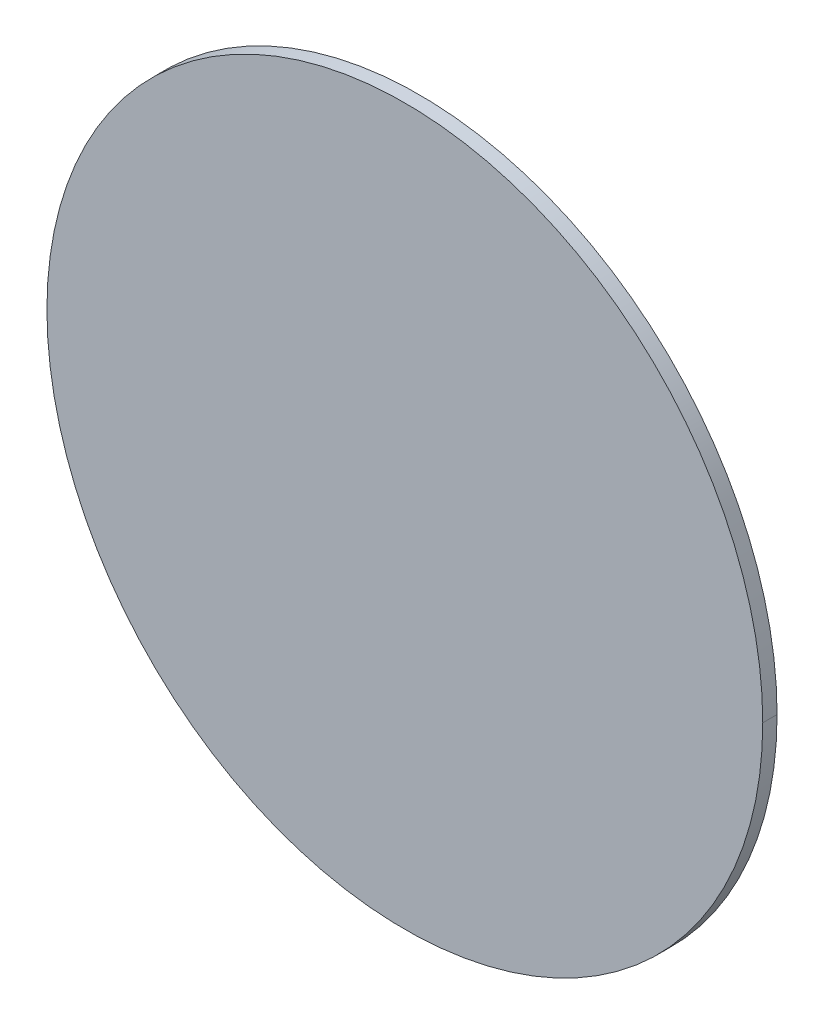
ISO-10303-21;
HEADER;
FILE_DESCRIPTION(('STEP AP214'),'2;1');
FILE_NAME('part.step','',(''),(''),'','','');
FILE_SCHEMA(('AUTOMOTIVE_DESIGN { 1 0 10303 214 1 1 1 1 }'));
ENDSEC;
DATA;
#1=APPLICATION_CONTEXT('core data for automotive mechanical design processes');
#2=APPLICATION_PROTOCOL_DEFINITION('international standard','automotive_design',2000,#1);
#3=PRODUCT_CONTEXT('',#1,'mechanical');
#4=PRODUCT('Part','Part','',(#3));
#5=PRODUCT_RELATED_PRODUCT_CATEGORY('part','',(#4));
#6=PRODUCT_DEFINITION_FORMATION('','',#4);
#7=PRODUCT_DEFINITION_CONTEXT('part definition',#1,'design');
#8=PRODUCT_DEFINITION('design','',#6,#7);
#9=PRODUCT_DEFINITION_SHAPE('','',#8);
#10=(LENGTH_UNIT() NAMED_UNIT(*) SI_UNIT(.MILLI.,.METRE.));
#11=(NAMED_UNIT(*) PLANE_ANGLE_UNIT() SI_UNIT($,.RADIAN.));
#12=(NAMED_UNIT(*) SI_UNIT($,.STERADIAN.) SOLID_ANGLE_UNIT());
#13=UNCERTAINTY_MEASURE_WITH_UNIT(LENGTH_MEASURE(1.E-05),#10,'distance_accuracy_value','');
#14=(GEOMETRIC_REPRESENTATION_CONTEXT(3) GLOBAL_UNCERTAINTY_ASSIGNED_CONTEXT((#13)) GLOBAL_UNIT_ASSIGNED_CONTEXT((#10,
#11,#12)) REPRESENTATION_CONTEXT('',''));
#15=CARTESIAN_POINT('',(0.,0.,0.));
#16=DIRECTION('',(0.,0.,1.));
#17=DIRECTION('',(1.,0.,0.));
#18=AXIS2_PLACEMENT_3D('',#15,#16,#17);
#19=CARTESIAN_POINT('',(0.,0.,4.));
#20=DIRECTION('',(0.,0.,1.));
#21=DIRECTION('',(1.,0.,0.));
#22=AXIS2_PLACEMENT_3D('',#19,#20,#21);
#23=PLANE('',#22);
#24=CARTESIAN_POINT('',(0.,0.,4.));
#25=DIRECTION('',(0.,0.,1.));
#26=DIRECTION('',(1.,0.,0.));
#27=AXIS2_PLACEMENT_3D('',#24,#25,#26);
#28=CIRCLE('',#27,100.);
#29=CARTESIAN_POINT('',(-100.,0.,4.));
#30=VERTEX_POINT('',#29);
#31=CARTESIAN_POINT('',(100.,0.,4.));
#32=VERTEX_POINT('',#31);
#33=EDGE_CURVE('E20',#30,#32,#28,.F.);
#34=ORIENTED_EDGE('',*,*,#33,.F.);
#35=CARTESIAN_POINT('',(0.,0.,4.));
#36=DIRECTION('',(0.,0.,1.));
#37=DIRECTION('',(1.,0.,0.));
#38=AXIS2_PLACEMENT_3D('',#35,#36,#37);
#39=CIRCLE('',#38,100.);
#40=EDGE_CURVE('E50',#32,#30,#39,.F.);
#41=ORIENTED_EDGE('',*,*,#40,.F.);
#42=EDGE_LOOP('',(#34,#41));
#43=FACE_BOUND('',#42,.T.);
#44=ADVANCED_FACE('F17',(#43),#23,.T.);
#45=CARTESIAN_POINT('',(0.,0.,-282.842712474619));
#46=DIRECTION('',(0.,0.,1.));
#47=DIRECTION('',(1.,0.,0.));
#48=AXIS2_PLACEMENT_3D('',#45,#46,#47);
#49=CYLINDRICAL_SURFACE('',#48,100.);
#50=ORIENTED_EDGE('',*,*,#33,.T.);
#51=DIRECTION('',(0.,0.,1.));
#52=VECTOR('',#51,1.);
#53=CARTESIAN_POINT('',(100.,0.,-282.842712474619));
#54=LINE('',#53,#52);
#55=CARTESIAN_POINT('',(100.,0.,0.));
#56=VERTEX_POINT('',#55);
#57=EDGE_CURVE('E48',#56,#32,#54,.T.);
#58=ORIENTED_EDGE('',*,*,#57,.F.);
#59=CARTESIAN_POINT('',(0.,0.,0.));
#60=DIRECTION('',(0.,0.,1.));
#61=DIRECTION('',(1.,0.,0.));
#62=AXIS2_PLACEMENT_3D('',#59,#60,#61);
#63=CIRCLE('',#62,100.);
#64=CARTESIAN_POINT('',(-100.,0.,0.));
#65=VERTEX_POINT('',#64);
#66=EDGE_CURVE('E26',#56,#65,#63,.T.);
#67=ORIENTED_EDGE('',*,*,#66,.T.);
#68=DIRECTION('',(0.,0.,1.));
#69=VECTOR('',#68,1.);
#70=CARTESIAN_POINT('',(-100.,0.,-282.842712474619));
#71=LINE('',#70,#69);
#72=EDGE_CURVE('E34',#30,#65,#71,.F.);
#73=ORIENTED_EDGE('',*,*,#72,.F.);
#74=EDGE_LOOP('',(#50,#58,#67,#73));
#75=FACE_BOUND('',#74,.T.);
#76=ADVANCED_FACE('F46',(#75),#49,.T.);
#77=CARTESIAN_POINT('',(0.,0.,-282.842712474619));
#78=DIRECTION('',(0.,0.,1.));
#79=DIRECTION('',(1.,0.,0.));
#80=AXIS2_PLACEMENT_3D('',#77,#78,#79);
#81=CYLINDRICAL_SURFACE('',#80,100.);
#82=ORIENTED_EDGE('',*,*,#57,.T.);
#83=ORIENTED_EDGE('',*,*,#40,.T.);
#84=ORIENTED_EDGE('',*,*,#72,.T.);
#85=CARTESIAN_POINT('',(0.,0.,0.));
#86=DIRECTION('',(0.,0.,1.));
#87=DIRECTION('',(1.,0.,0.));
#88=AXIS2_PLACEMENT_3D('',#85,#86,#87);
#89=CIRCLE('',#88,100.);
#90=EDGE_CURVE('E11',#65,#56,#89,.T.);
#91=ORIENTED_EDGE('',*,*,#90,.T.);
#92=EDGE_LOOP('',(#82,#83,#84,#91));
#93=FACE_BOUND('',#92,.T.);
#94=ADVANCED_FACE('F49',(#93),#81,.T.);
#95=CARTESIAN_POINT('',(0.,0.,0.));
#96=DIRECTION('',(0.,0.,1.));
#97=DIRECTION('',(1.,0.,0.));
#98=AXIS2_PLACEMENT_3D('',#95,#96,#97);
#99=PLANE('',#98);
#100=ORIENTED_EDGE('',*,*,#66,.F.);
#101=ORIENTED_EDGE('',*,*,#90,.F.);
#102=EDGE_LOOP('',(#100,#101));
#103=FACE_BOUND('',#102,.T.);
#104=ADVANCED_FACE('F55',(#103),#99,.F.);
#105=CLOSED_SHELL('',(#44,#76,#94,#104));
#106=MANIFOLD_SOLID_BREP('B1',#105);
#107=ADVANCED_BREP_SHAPE_REPRESENTATION('',(#18,#106),#14);
#108=SHAPE_DEFINITION_REPRESENTATION(#9,#107);
ENDSEC;
END-ISO-10303-21;
